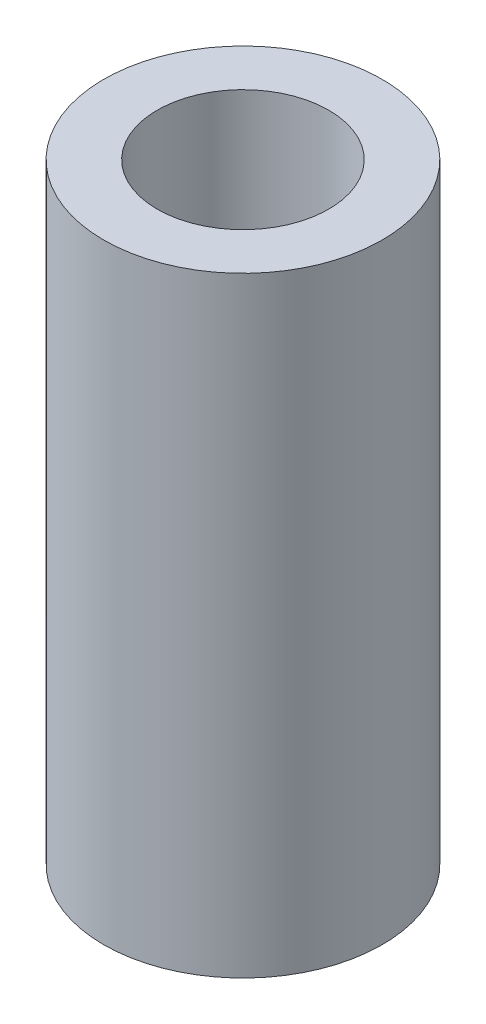
ISO-10303-21;
HEADER;
FILE_DESCRIPTION(('STEP AP214'),'2;1');
FILE_NAME('part.step','',(''),(''),'','','');
FILE_SCHEMA(('AUTOMOTIVE_DESIGN { 1 0 10303 214 1 1 1 1 }'));
ENDSEC;
DATA;
#1=APPLICATION_CONTEXT('core data for automotive mechanical design processes');
#2=APPLICATION_PROTOCOL_DEFINITION('international standard','automotive_design',2000,#1);
#3=PRODUCT_CONTEXT('',#1,'mechanical');
#4=PRODUCT('Part','Part','',(#3));
#5=PRODUCT_RELATED_PRODUCT_CATEGORY('part','',(#4));
#6=PRODUCT_DEFINITION_FORMATION('','',#4);
#7=PRODUCT_DEFINITION_CONTEXT('part definition',#1,'design');
#8=PRODUCT_DEFINITION('design','',#6,#7);
#9=PRODUCT_DEFINITION_SHAPE('','',#8);
#10=(LENGTH_UNIT() NAMED_UNIT(*) SI_UNIT(.MILLI.,.METRE.));
#11=(NAMED_UNIT(*) PLANE_ANGLE_UNIT() SI_UNIT($,.RADIAN.));
#12=(NAMED_UNIT(*) SI_UNIT($,.STERADIAN.) SOLID_ANGLE_UNIT());
#13=UNCERTAINTY_MEASURE_WITH_UNIT(LENGTH_MEASURE(1.E-05),#10,'distance_accuracy_value','');
#14=(GEOMETRIC_REPRESENTATION_CONTEXT(3) GLOBAL_UNCERTAINTY_ASSIGNED_CONTEXT((#13)) GLOBAL_UNIT_ASSIGNED_CONTEXT((#10,
#11,#12)) REPRESENTATION_CONTEXT('',''));
#15=CARTESIAN_POINT('',(0.,0.,0.));
#16=DIRECTION('',(0.,0.,1.));
#17=DIRECTION('',(1.,0.,0.));
#18=AXIS2_PLACEMENT_3D('',#15,#16,#17);
#19=CARTESIAN_POINT('',(0.,21.7,0.));
#20=DIRECTION('',(0.,1.,0.));
#21=DIRECTION('',(0.,0.,1.));
#22=AXIS2_PLACEMENT_3D('',#19,#20,#21);
#23=PLANE('',#22);
#24=CARTESIAN_POINT('',(0.,21.7,0.));
#25=DIRECTION('',(0.,1.,0.));
#26=DIRECTION('',(0.,0.,1.));
#27=AXIS2_PLACEMENT_3D('',#24,#25,#26);
#28=CIRCLE('',#27,4.95);
#29=CARTESIAN_POINT('',(0.,21.7,4.95));
#30=VERTEX_POINT('',#29);
#31=EDGE_CURVE('E10',#30,#30,#28,.T.);
#32=ORIENTED_EDGE('',*,*,#31,.T.);
#33=EDGE_LOOP('',(#32));
#34=FACE_BOUND('',#33,.T.);
#35=CARTESIAN_POINT('',(0.,21.7,0.));
#36=DIRECTION('',(0.,1.,0.));
#37=DIRECTION('',(0.,0.,1.));
#38=AXIS2_PLACEMENT_3D('',#35,#36,#37);
#39=CIRCLE('',#38,3.05);
#40=CARTESIAN_POINT('',(0.,21.7,3.05));
#41=VERTEX_POINT('',#40);
#42=EDGE_CURVE('E50',#41,#41,#39,.T.);
#43=ORIENTED_EDGE('',*,*,#42,.F.);
#44=EDGE_LOOP('',(#43));
#45=FACE_BOUND('',#44,.T.);
#46=ADVANCED_FACE('F37',(#34,#45),#23,.T.);
#47=CARTESIAN_POINT('',(0.,0.,0.));
#48=DIRECTION('',(0.,1.,0.));
#49=DIRECTION('',(0.,0.,1.));
#50=AXIS2_PLACEMENT_3D('',#47,#48,#49);
#51=PLANE('',#50);
#52=CARTESIAN_POINT('',(0.,0.,0.));
#53=DIRECTION('',(0.,1.,0.));
#54=DIRECTION('',(0.,0.,1.));
#55=AXIS2_PLACEMENT_3D('',#52,#53,#54);
#56=CIRCLE('',#55,4.95);
#57=CARTESIAN_POINT('',(0.,0.,4.95));
#58=VERTEX_POINT('',#57);
#59=EDGE_CURVE('E41',#58,#58,#56,.T.);
#60=ORIENTED_EDGE('',*,*,#59,.F.);
#61=EDGE_LOOP('',(#60));
#62=FACE_BOUND('',#61,.T.);
#63=CARTESIAN_POINT('',(0.,0.,0.));
#64=DIRECTION('',(0.,1.,0.));
#65=DIRECTION('',(0.,0.,1.));
#66=AXIS2_PLACEMENT_3D('',#63,#64,#65);
#67=CIRCLE('',#66,3.05);
#68=CARTESIAN_POINT('',(0.,0.,3.05));
#69=VERTEX_POINT('',#68);
#70=EDGE_CURVE('E52',#69,#69,#67,.T.);
#71=ORIENTED_EDGE('',*,*,#70,.T.);
#72=EDGE_LOOP('',(#71));
#73=FACE_BOUND('',#72,.T.);
#74=ADVANCED_FACE('F64',(#62,#73),#51,.F.);
#75=CARTESIAN_POINT('',(0.,21.7,0.));
#76=DIRECTION('',(0.,-1.,0.));
#77=DIRECTION('',(0.,0.,-1.));
#78=AXIS2_PLACEMENT_3D('',#75,#76,#77);
#79=CYLINDRICAL_SURFACE('',#78,4.95);
#80=ORIENTED_EDGE('',*,*,#31,.F.);
#81=EDGE_LOOP('',(#80));
#82=FACE_BOUND('',#81,.T.);
#83=ORIENTED_EDGE('',*,*,#59,.T.);
#84=EDGE_LOOP('',(#83));
#85=FACE_BOUND('',#84,.T.);
#86=ADVANCED_FACE('F39',(#82,#85),#79,.T.);
#87=CARTESIAN_POINT('',(0.,21.7,0.));
#88=DIRECTION('',(0.,-1.,0.));
#89=DIRECTION('',(0.,0.,-1.));
#90=AXIS2_PLACEMENT_3D('',#87,#88,#89);
#91=CYLINDRICAL_SURFACE('',#90,3.05);
#92=ORIENTED_EDGE('',*,*,#42,.T.);
#93=EDGE_LOOP('',(#92));
#94=FACE_BOUND('',#93,.T.);
#95=ORIENTED_EDGE('',*,*,#70,.F.);
#96=EDGE_LOOP('',(#95));
#97=FACE_BOUND('',#96,.T.);
#98=ADVANCED_FACE('F60',(#94,#97),#91,.F.);
#99=CLOSED_SHELL('',(#46,#74,#86,#98));
#100=MANIFOLD_SOLID_BREP('B2',#99);
#101=ADVANCED_BREP_SHAPE_REPRESENTATION('',(#18,#100),#14);
#102=SHAPE_DEFINITION_REPRESENTATION(#9,#101);
ENDSEC;
END-ISO-10303-21;
